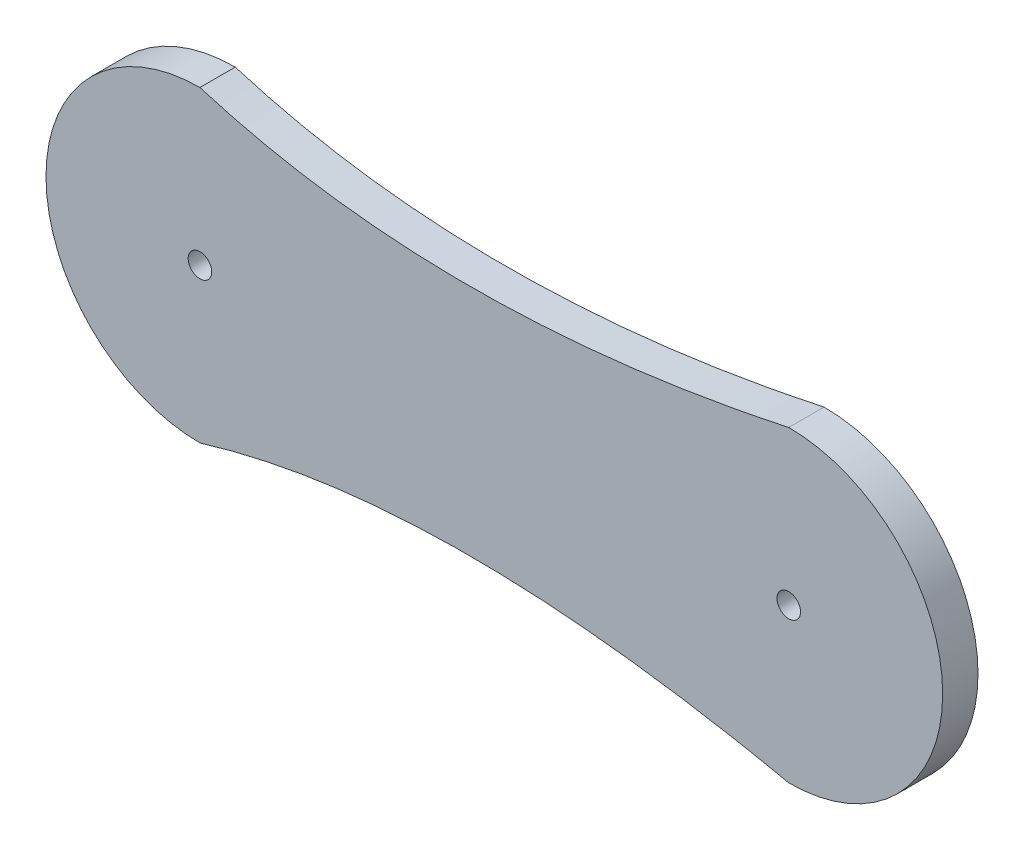
ISO-10303-21;
HEADER;
FILE_DESCRIPTION(('STEP AP214'),'2;1');
FILE_NAME('part.step','',(''),(''),'','','');
FILE_SCHEMA(('AUTOMOTIVE_DESIGN { 1 0 10303 214 1 1 1 1 }'));
ENDSEC;
DATA;
#1=APPLICATION_CONTEXT('core data for automotive mechanical design processes');
#2=APPLICATION_PROTOCOL_DEFINITION('international standard','automotive_design',2000,#1);
#3=PRODUCT_CONTEXT('',#1,'mechanical');
#4=PRODUCT('Part','Part','',(#3));
#5=PRODUCT_RELATED_PRODUCT_CATEGORY('part','',(#4));
#6=PRODUCT_DEFINITION_FORMATION('','',#4);
#7=PRODUCT_DEFINITION_CONTEXT('part definition',#1,'design');
#8=PRODUCT_DEFINITION('design','',#6,#7);
#9=PRODUCT_DEFINITION_SHAPE('','',#8);
#10=(LENGTH_UNIT() NAMED_UNIT(*) SI_UNIT(.MILLI.,.METRE.));
#11=(NAMED_UNIT(*) PLANE_ANGLE_UNIT() SI_UNIT($,.RADIAN.));
#12=(NAMED_UNIT(*) SI_UNIT($,.STERADIAN.) SOLID_ANGLE_UNIT());
#13=UNCERTAINTY_MEASURE_WITH_UNIT(LENGTH_MEASURE(1.E-05),#10,'distance_accuracy_value','');
#14=(GEOMETRIC_REPRESENTATION_CONTEXT(3) GLOBAL_UNCERTAINTY_ASSIGNED_CONTEXT((#13)) GLOBAL_UNIT_ASSIGNED_CONTEXT((#10,
#11,#12)) REPRESENTATION_CONTEXT('',''));
#15=CARTESIAN_POINT('',(0.,0.,0.));
#16=DIRECTION('',(0.,0.,1.));
#17=DIRECTION('',(1.,0.,0.));
#18=AXIS2_PLACEMENT_3D('',#15,#16,#17);
#19=CARTESIAN_POINT('',(-25.,-13.069,3.));
#20=CARTESIAN_POINT('',(-4.3274762398374,-6.75242360120828,3.));
#21=CARTESIAN_POINT('',(25.,-13.069,3.));
#22=B_SPLINE_CURVE_WITH_KNOTS('',2,(#19,#20,#21),.UNSPECIFIED.,.F.,.F.,(3,3),(0.,1.),.UNSPECIFIED.);
#23=DIRECTION('',(0.,0.,-1.));
#24=VECTOR('',#23,1.);
#25=SURFACE_OF_LINEAR_EXTRUSION('',#22,#24);
#26=CARTESIAN_POINT('',(-25.,-13.069,0.));
#27=CARTESIAN_POINT('',(-4.3274762398374,-6.75242360120828,0.));
#28=CARTESIAN_POINT('',(25.,-13.069,0.));
#29=B_SPLINE_CURVE_WITH_KNOTS('',2,(#26,#27,#28),.UNSPECIFIED.,.F.,.F.,(3,3),(0.,1.),.UNSPECIFIED.);
#30=CARTESIAN_POINT('',(-25.,-13.069,0.));
#31=VERTEX_POINT('',#30);
#32=CARTESIAN_POINT('',(25.,-13.069,0.));
#33=VERTEX_POINT('',#32);
#34=EDGE_CURVE('E119',#31,#33,#29,.T.);
#35=ORIENTED_EDGE('',*,*,#34,.T.);
#36=DIRECTION('',(0.,0.,-1.));
#37=VECTOR('',#36,1.);
#38=CARTESIAN_POINT('',(25.,-13.069,3.));
#39=LINE('',#38,#37);
#40=CARTESIAN_POINT('',(25.,-13.069,3.));
#41=VERTEX_POINT('',#40);
#42=EDGE_CURVE('E11',#41,#33,#39,.T.);
#43=ORIENTED_EDGE('',*,*,#42,.F.);
#44=CARTESIAN_POINT('',(-25.,-13.069,3.));
#45=VERTEX_POINT('',#44);
#46=EDGE_CURVE('E75',#45,#41,#22,.T.);
#47=ORIENTED_EDGE('',*,*,#46,.F.);
#48=DIRECTION('',(0.,0.,-1.));
#49=VECTOR('',#48,1.);
#50=CARTESIAN_POINT('',(-25.,-13.069,3.));
#51=LINE('',#50,#49);
#52=EDGE_CURVE('E120',#45,#31,#51,.T.);
#53=ORIENTED_EDGE('',*,*,#52,.T.);
#54=EDGE_LOOP('',(#35,#43,#47,#53));
#55=FACE_BOUND('',#54,.T.);
#56=ADVANCED_FACE('F35',(#55),#25,.F.);
#57=CARTESIAN_POINT('',(25.,0.,3.));
#58=DIRECTION('',(0.,0.,-1.));
#59=DIRECTION('',(-1.,0.,0.));
#60=AXIS2_PLACEMENT_3D('',#57,#58,#59);
#61=CYLINDRICAL_SURFACE('',#60,13.069);
#62=CARTESIAN_POINT('',(25.,0.,0.));
#63=DIRECTION('',(0.,0.,1.));
#64=DIRECTION('',(1.,0.,0.));
#65=AXIS2_PLACEMENT_3D('',#62,#63,#64);
#66=CIRCLE('',#65,13.069);
#67=CARTESIAN_POINT('',(25.,13.069,0.));
#68=VERTEX_POINT('',#67);
#69=EDGE_CURVE('E84',#68,#33,#66,.F.);
#70=ORIENTED_EDGE('',*,*,#69,.F.);
#71=DIRECTION('',(0.,0.,-1.));
#72=VECTOR('',#71,1.);
#73=CARTESIAN_POINT('',(25.,13.069,3.));
#74=LINE('',#73,#72);
#75=CARTESIAN_POINT('',(25.,13.069,3.));
#76=VERTEX_POINT('',#75);
#77=EDGE_CURVE('E44',#76,#68,#74,.T.);
#78=ORIENTED_EDGE('',*,*,#77,.F.);
#79=CARTESIAN_POINT('',(25.,0.,3.));
#80=DIRECTION('',(0.,0.,1.));
#81=DIRECTION('',(1.,0.,0.));
#82=AXIS2_PLACEMENT_3D('',#79,#80,#81);
#83=CIRCLE('',#82,13.069);
#84=EDGE_CURVE('E82',#76,#41,#83,.F.);
#85=ORIENTED_EDGE('',*,*,#84,.T.);
#86=ORIENTED_EDGE('',*,*,#42,.T.);
#87=EDGE_LOOP('',(#70,#78,#85,#86));
#88=FACE_BOUND('',#87,.T.);
#89=ADVANCED_FACE('F81',(#88),#61,.T.);
#90=CARTESIAN_POINT('',(-25.,13.069,3.));
#91=CARTESIAN_POINT('',(-4.32747623983741,6.75242360120829,3.));
#92=CARTESIAN_POINT('',(25.,13.069,3.));
#93=B_SPLINE_CURVE_WITH_KNOTS('',2,(#90,#91,#92),.UNSPECIFIED.,.F.,.F.,(3,3),(0.,1.),.UNSPECIFIED.);
#94=DIRECTION('',(0.,0.,-1.));
#95=VECTOR('',#94,1.);
#96=SURFACE_OF_LINEAR_EXTRUSION('',#93,#95);
#97=CARTESIAN_POINT('',(-25.,13.069,0.));
#98=CARTESIAN_POINT('',(-4.32747623983741,6.75242360120829,0.));
#99=CARTESIAN_POINT('',(25.,13.069,0.));
#100=B_SPLINE_CURVE_WITH_KNOTS('',2,(#97,#98,#99),.UNSPECIFIED.,.F.,.F.,(3,3),(0.,1.),.UNSPECIFIED.);
#101=CARTESIAN_POINT('',(-25.,13.069,0.));
#102=VERTEX_POINT('',#101);
#103=EDGE_CURVE('E125',#102,#68,#100,.T.);
#104=ORIENTED_EDGE('',*,*,#103,.F.);
#105=DIRECTION('',(0.,0.,-1.));
#106=VECTOR('',#105,1.);
#107=CARTESIAN_POINT('',(-25.,13.069,3.));
#108=LINE('',#107,#106);
#109=CARTESIAN_POINT('',(-25.,13.069,3.));
#110=VERTEX_POINT('',#109);
#111=EDGE_CURVE('E67',#110,#102,#108,.T.);
#112=ORIENTED_EDGE('',*,*,#111,.F.);
#113=EDGE_CURVE('E91',#110,#76,#93,.T.);
#114=ORIENTED_EDGE('',*,*,#113,.T.);
#115=ORIENTED_EDGE('',*,*,#77,.T.);
#116=EDGE_LOOP('',(#104,#112,#114,#115));
#117=FACE_BOUND('',#116,.T.);
#118=ADVANCED_FACE('F93',(#117),#96,.T.);
#119=CARTESIAN_POINT('',(-25.,0.,3.));
#120=DIRECTION('',(0.,0.,-1.));
#121=DIRECTION('',(-1.,0.,0.));
#122=AXIS2_PLACEMENT_3D('',#119,#120,#121);
#123=CYLINDRICAL_SURFACE('',#122,1.);
#124=CARTESIAN_POINT('',(-25.,0.,3.));
#125=DIRECTION('',(0.,0.,1.));
#126=DIRECTION('',(1.,0.,0.));
#127=AXIS2_PLACEMENT_3D('',#124,#125,#126);
#128=CIRCLE('',#127,1.);
#129=CARTESIAN_POINT('',(-24.,0.,3.));
#130=VERTEX_POINT('',#129);
#131=EDGE_CURVE('E95',#130,#130,#128,.F.);
#132=ORIENTED_EDGE('',*,*,#131,.F.);
#133=EDGE_LOOP('',(#132));
#134=FACE_BOUND('',#133,.T.);
#135=CARTESIAN_POINT('',(-25.,0.,0.));
#136=DIRECTION('',(0.,0.,1.));
#137=DIRECTION('',(1.,0.,0.));
#138=AXIS2_PLACEMENT_3D('',#135,#136,#137);
#139=CIRCLE('',#138,1.);
#140=CARTESIAN_POINT('',(-24.,0.,0.));
#141=VERTEX_POINT('',#140);
#142=EDGE_CURVE('E138',#141,#141,#139,.F.);
#143=ORIENTED_EDGE('',*,*,#142,.T.);
#144=EDGE_LOOP('',(#143));
#145=FACE_BOUND('',#144,.T.);
#146=ADVANCED_FACE('F107',(#134,#145),#123,.F.);
#147=CARTESIAN_POINT('',(-25.,0.,3.));
#148=DIRECTION('',(0.,0.,-1.));
#149=DIRECTION('',(-1.,0.,0.));
#150=AXIS2_PLACEMENT_3D('',#147,#148,#149);
#151=CYLINDRICAL_SURFACE('',#150,13.069);
#152=CARTESIAN_POINT('',(-25.,0.,0.));
#153=DIRECTION('',(0.,0.,1.));
#154=DIRECTION('',(1.,0.,0.));
#155=AXIS2_PLACEMENT_3D('',#152,#153,#154);
#156=CIRCLE('',#155,13.069);
#157=EDGE_CURVE('E70',#102,#31,#156,.T.);
#158=ORIENTED_EDGE('',*,*,#157,.T.);
#159=ORIENTED_EDGE('',*,*,#52,.F.);
#160=CARTESIAN_POINT('',(-25.,0.,3.));
#161=DIRECTION('',(0.,0.,1.));
#162=DIRECTION('',(1.,0.,0.));
#163=AXIS2_PLACEMENT_3D('',#160,#161,#162);
#164=CIRCLE('',#163,13.069);
#165=EDGE_CURVE('E52',#110,#45,#164,.T.);
#166=ORIENTED_EDGE('',*,*,#165,.F.);
#167=ORIENTED_EDGE('',*,*,#111,.T.);
#168=EDGE_LOOP('',(#158,#159,#166,#167));
#169=FACE_BOUND('',#168,.T.);
#170=ADVANCED_FACE('F108',(#169),#151,.T.);
#171=CARTESIAN_POINT('',(25.,0.,3.));
#172=DIRECTION('',(0.,0.,-1.));
#173=DIRECTION('',(-1.,0.,0.));
#174=AXIS2_PLACEMENT_3D('',#171,#172,#173);
#175=CYLINDRICAL_SURFACE('',#174,1.);
#176=CARTESIAN_POINT('',(25.,0.,3.));
#177=DIRECTION('',(0.,0.,1.));
#178=DIRECTION('',(1.,0.,0.));
#179=AXIS2_PLACEMENT_3D('',#176,#177,#178);
#180=CIRCLE('',#179,1.);
#181=CARTESIAN_POINT('',(26.,0.,3.));
#182=VERTEX_POINT('',#181);
#183=EDGE_CURVE('E145',#182,#182,#180,.T.);
#184=ORIENTED_EDGE('',*,*,#183,.T.);
#185=EDGE_LOOP('',(#184));
#186=FACE_BOUND('',#185,.T.);
#187=CARTESIAN_POINT('',(25.,0.,0.));
#188=DIRECTION('',(0.,0.,1.));
#189=DIRECTION('',(1.,0.,0.));
#190=AXIS2_PLACEMENT_3D('',#187,#188,#189);
#191=CIRCLE('',#190,1.);
#192=CARTESIAN_POINT('',(26.,0.,0.));
#193=VERTEX_POINT('',#192);
#194=EDGE_CURVE('E141',#193,#193,#191,.T.);
#195=ORIENTED_EDGE('',*,*,#194,.F.);
#196=EDGE_LOOP('',(#195));
#197=FACE_BOUND('',#196,.T.);
#198=ADVANCED_FACE('F161',(#186,#197),#175,.F.);
#199=CARTESIAN_POINT('',(0.,0.,3.));
#200=DIRECTION('',(0.,0.,1.));
#201=DIRECTION('',(1.,0.,0.));
#202=AXIS2_PLACEMENT_3D('',#199,#200,#201);
#203=PLANE('',#202);
#204=ORIENTED_EDGE('',*,*,#46,.T.);
#205=ORIENTED_EDGE('',*,*,#84,.F.);
#206=ORIENTED_EDGE('',*,*,#113,.F.);
#207=ORIENTED_EDGE('',*,*,#165,.T.);
#208=EDGE_LOOP('',(#204,#205,#206,#207));
#209=FACE_BOUND('',#208,.T.);
#210=ORIENTED_EDGE('',*,*,#131,.T.);
#211=EDGE_LOOP('',(#210));
#212=FACE_BOUND('',#211,.T.);
#213=ORIENTED_EDGE('',*,*,#183,.F.);
#214=EDGE_LOOP('',(#213));
#215=FACE_BOUND('',#214,.T.);
#216=ADVANCED_FACE('F89',(#209,#212,#215),#203,.T.);
#217=CARTESIAN_POINT('',(0.,0.,0.));
#218=DIRECTION('',(0.,0.,1.));
#219=DIRECTION('',(1.,0.,0.));
#220=AXIS2_PLACEMENT_3D('',#217,#218,#219);
#221=PLANE('',#220);
#222=ORIENTED_EDGE('',*,*,#34,.F.);
#223=ORIENTED_EDGE('',*,*,#157,.F.);
#224=ORIENTED_EDGE('',*,*,#103,.T.);
#225=ORIENTED_EDGE('',*,*,#69,.T.);
#226=EDGE_LOOP('',(#222,#223,#224,#225));
#227=FACE_BOUND('',#226,.T.);
#228=ORIENTED_EDGE('',*,*,#142,.F.);
#229=EDGE_LOOP('',(#228));
#230=FACE_BOUND('',#229,.T.);
#231=ORIENTED_EDGE('',*,*,#194,.T.);
#232=EDGE_LOOP('',(#231));
#233=FACE_BOUND('',#232,.T.);
#234=ADVANCED_FACE('F123',(#227,#230,#233),#221,.F.);
#235=CLOSED_SHELL('',(#56,#89,#118,#146,#170,#198,#216,#234));
#236=MANIFOLD_SOLID_BREP('B2',#235);
#237=ADVANCED_BREP_SHAPE_REPRESENTATION('',(#18,#236),#14);
#238=SHAPE_DEFINITION_REPRESENTATION(#9,#237);
ENDSEC;
END-ISO-10303-21;
